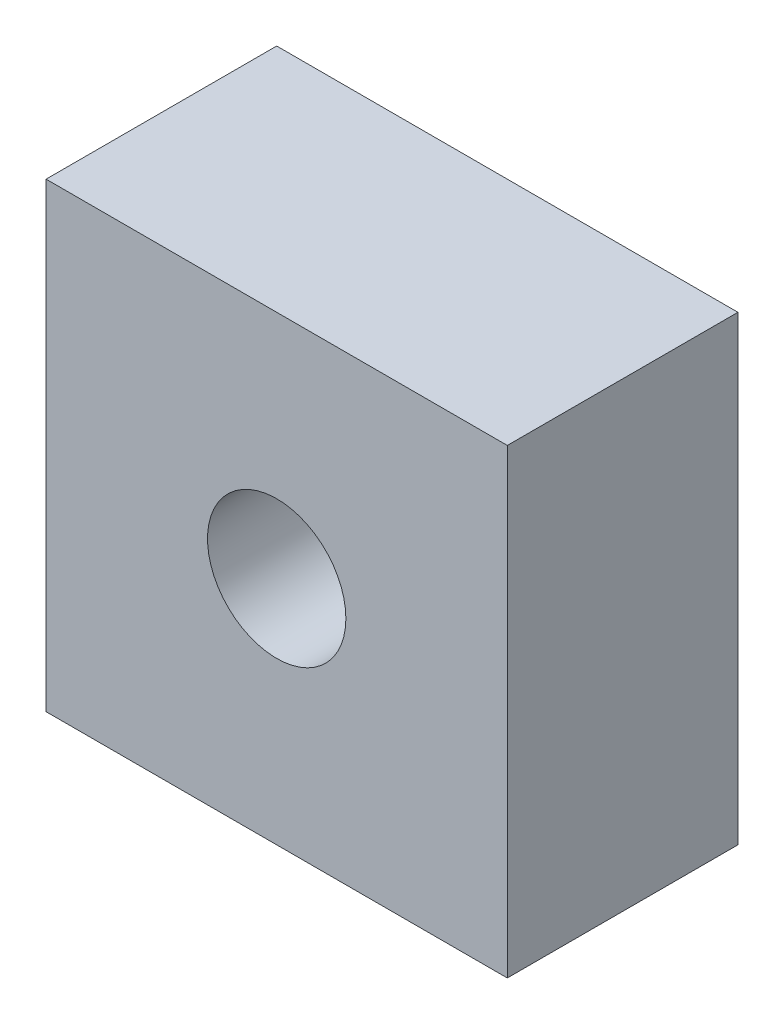
ISO-10303-21;
HEADER;
FILE_DESCRIPTION(('STEP AP214'),'2;1');
FILE_NAME('part.step','',(''),(''),'','','');
FILE_SCHEMA(('AUTOMOTIVE_DESIGN { 1 0 10303 214 1 1 1 1 }'));
ENDSEC;
DATA;
#1=APPLICATION_CONTEXT('core data for automotive mechanical design processes');
#2=APPLICATION_PROTOCOL_DEFINITION('international standard','automotive_design',2000,#1);
#3=PRODUCT_CONTEXT('',#1,'mechanical');
#4=PRODUCT('Part','Part','',(#3));
#5=PRODUCT_RELATED_PRODUCT_CATEGORY('part','',(#4));
#6=PRODUCT_DEFINITION_FORMATION('','',#4);
#7=PRODUCT_DEFINITION_CONTEXT('part definition',#1,'design');
#8=PRODUCT_DEFINITION('design','',#6,#7);
#9=PRODUCT_DEFINITION_SHAPE('','',#8);
#10=(LENGTH_UNIT() NAMED_UNIT(*) SI_UNIT(.MILLI.,.METRE.));
#11=(NAMED_UNIT(*) PLANE_ANGLE_UNIT() SI_UNIT($,.RADIAN.));
#12=(NAMED_UNIT(*) SI_UNIT($,.STERADIAN.) SOLID_ANGLE_UNIT());
#13=UNCERTAINTY_MEASURE_WITH_UNIT(LENGTH_MEASURE(1.E-05),#10,'distance_accuracy_value','');
#14=(GEOMETRIC_REPRESENTATION_CONTEXT(3) GLOBAL_UNCERTAINTY_ASSIGNED_CONTEXT((#13)) GLOBAL_UNIT_ASSIGNED_CONTEXT((#10,
#11,#12)) REPRESENTATION_CONTEXT('',''));
#15=CARTESIAN_POINT('',(0.,0.,0.));
#16=DIRECTION('',(0.,0.,1.));
#17=DIRECTION('',(1.,0.,0.));
#18=AXIS2_PLACEMENT_3D('',#15,#16,#17);
#19=CARTESIAN_POINT('',(0.,0.,10.));
#20=DIRECTION('',(1.,0.,0.));
#21=DIRECTION('',(0.,0.,-1.));
#22=AXIS2_PLACEMENT_3D('',#19,#20,#21);
#23=PLANE('',#22);
#24=DIRECTION('',(0.,-1.,0.));
#25=VECTOR('',#24,1.);
#26=CARTESIAN_POINT('',(0.,0.,0.));
#27=LINE('',#26,#25);
#28=CARTESIAN_POINT('',(0.,20.,0.));
#29=VERTEX_POINT('',#28);
#30=CARTESIAN_POINT('',(0.,0.,0.));
#31=VERTEX_POINT('',#30);
#32=EDGE_CURVE('E104',#29,#31,#27,.T.);
#33=ORIENTED_EDGE('',*,*,#32,.T.);
#34=DIRECTION('',(0.,0.,-1.));
#35=VECTOR('',#34,1.);
#36=CARTESIAN_POINT('',(0.,0.,10.));
#37=LINE('',#36,#35);
#38=CARTESIAN_POINT('',(0.,0.,10.));
#39=VERTEX_POINT('',#38);
#40=EDGE_CURVE('E11',#39,#31,#37,.T.);
#41=ORIENTED_EDGE('',*,*,#40,.F.);
#42=DIRECTION('',(0.,-1.,0.));
#43=VECTOR('',#42,1.);
#44=CARTESIAN_POINT('',(0.,0.,10.));
#45=LINE('',#44,#43);
#46=CARTESIAN_POINT('',(0.,20.,10.));
#47=VERTEX_POINT('',#46);
#48=EDGE_CURVE('E91',#47,#39,#45,.T.);
#49=ORIENTED_EDGE('',*,*,#48,.F.);
#50=DIRECTION('',(0.,0.,-1.));
#51=VECTOR('',#50,1.);
#52=CARTESIAN_POINT('',(0.,20.,10.));
#53=LINE('',#52,#51);
#54=EDGE_CURVE('E101',#47,#29,#53,.T.);
#55=ORIENTED_EDGE('',*,*,#54,.T.);
#56=EDGE_LOOP('',(#33,#41,#49,#55));
#57=FACE_BOUND('',#56,.T.);
#58=ADVANCED_FACE('F45',(#57),#23,.F.);
#59=CARTESIAN_POINT('',(0.,0.,10.));
#60=DIRECTION('',(0.,1.,0.));
#61=DIRECTION('',(0.,0.,1.));
#62=AXIS2_PLACEMENT_3D('',#59,#60,#61);
#63=PLANE('',#62);
#64=DIRECTION('',(1.,0.,0.));
#65=VECTOR('',#64,1.);
#66=CARTESIAN_POINT('',(0.,0.,0.));
#67=LINE('',#66,#65);
#68=CARTESIAN_POINT('',(20.,0.,0.));
#69=VERTEX_POINT('',#68);
#70=EDGE_CURVE('E100',#31,#69,#67,.T.);
#71=ORIENTED_EDGE('',*,*,#70,.T.);
#72=DIRECTION('',(0.,0.,-1.));
#73=VECTOR('',#72,1.);
#74=CARTESIAN_POINT('',(20.,0.,10.));
#75=LINE('',#74,#73);
#76=CARTESIAN_POINT('',(20.,0.,10.));
#77=VERTEX_POINT('',#76);
#78=EDGE_CURVE('E49',#77,#69,#75,.T.);
#79=ORIENTED_EDGE('',*,*,#78,.F.);
#80=DIRECTION('',(1.,0.,0.));
#81=VECTOR('',#80,1.);
#82=CARTESIAN_POINT('',(0.,0.,10.));
#83=LINE('',#82,#81);
#84=EDGE_CURVE('E86',#39,#77,#83,.T.);
#85=ORIENTED_EDGE('',*,*,#84,.F.);
#86=ORIENTED_EDGE('',*,*,#40,.T.);
#87=EDGE_LOOP('',(#71,#79,#85,#86));
#88=FACE_BOUND('',#87,.T.);
#89=ADVANCED_FACE('F96',(#88),#63,.F.);
#90=CARTESIAN_POINT('',(20.,0.,10.));
#91=DIRECTION('',(-1.,0.,0.));
#92=DIRECTION('',(0.,0.,1.));
#93=AXIS2_PLACEMENT_3D('',#90,#91,#92);
#94=PLANE('',#93);
#95=DIRECTION('',(0.,1.,0.));
#96=VECTOR('',#95,1.);
#97=CARTESIAN_POINT('',(20.,0.,0.));
#98=LINE('',#97,#96);
#99=CARTESIAN_POINT('',(20.,20.,0.));
#100=VERTEX_POINT('',#99);
#101=EDGE_CURVE('E73',#69,#100,#98,.T.);
#102=ORIENTED_EDGE('',*,*,#101,.T.);
#103=DIRECTION('',(0.,0.,-1.));
#104=VECTOR('',#103,1.);
#105=CARTESIAN_POINT('',(20.,20.,10.));
#106=LINE('',#105,#104);
#107=CARTESIAN_POINT('',(20.,20.,10.));
#108=VERTEX_POINT('',#107);
#109=EDGE_CURVE('E98',#108,#100,#106,.T.);
#110=ORIENTED_EDGE('',*,*,#109,.F.);
#111=DIRECTION('',(0.,1.,0.));
#112=VECTOR('',#111,1.);
#113=CARTESIAN_POINT('',(20.,0.,10.));
#114=LINE('',#113,#112);
#115=EDGE_CURVE('E93',#77,#108,#114,.T.);
#116=ORIENTED_EDGE('',*,*,#115,.F.);
#117=ORIENTED_EDGE('',*,*,#78,.T.);
#118=EDGE_LOOP('',(#102,#110,#116,#117));
#119=FACE_BOUND('',#118,.T.);
#120=ADVANCED_FACE('F97',(#119),#94,.F.);
#121=CARTESIAN_POINT('',(0.,20.,10.));
#122=DIRECTION('',(0.,-1.,0.));
#123=DIRECTION('',(0.,0.,-1.));
#124=AXIS2_PLACEMENT_3D('',#121,#122,#123);
#125=PLANE('',#124);
#126=DIRECTION('',(-1.,0.,0.));
#127=VECTOR('',#126,1.);
#128=CARTESIAN_POINT('',(0.,20.,0.));
#129=LINE('',#128,#127);
#130=EDGE_CURVE('E81',#100,#29,#129,.T.);
#131=ORIENTED_EDGE('',*,*,#130,.T.);
#132=ORIENTED_EDGE('',*,*,#54,.F.);
#133=DIRECTION('',(-1.,0.,0.));
#134=VECTOR('',#133,1.);
#135=CARTESIAN_POINT('',(0.,20.,10.));
#136=LINE('',#135,#134);
#137=EDGE_CURVE('E59',#108,#47,#136,.T.);
#138=ORIENTED_EDGE('',*,*,#137,.F.);
#139=ORIENTED_EDGE('',*,*,#109,.T.);
#140=EDGE_LOOP('',(#131,#132,#138,#139));
#141=FACE_BOUND('',#140,.T.);
#142=ADVANCED_FACE('F114',(#141),#125,.F.);
#143=CARTESIAN_POINT('',(0.,0.,10.));
#144=DIRECTION('',(0.,0.,-1.));
#145=DIRECTION('',(-1.,0.,0.));
#146=AXIS2_PLACEMENT_3D('',#143,#144,#145);
#147=PLANE('',#146);
#148=CARTESIAN_POINT('',(10.,10.,10.));
#149=DIRECTION('',(0.,0.,1.));
#150=DIRECTION('',(1.,0.,0.));
#151=AXIS2_PLACEMENT_3D('',#148,#149,#150);
#152=CIRCLE('',#151,3.);
#153=CARTESIAN_POINT('',(13.,10.,10.));
#154=VERTEX_POINT('',#153);
#155=EDGE_CURVE('E122',#154,#154,#152,.T.);
#156=ORIENTED_EDGE('',*,*,#155,.F.);
#157=EDGE_LOOP('',(#156));
#158=FACE_BOUND('',#157,.T.);
#159=ORIENTED_EDGE('',*,*,#48,.T.);
#160=ORIENTED_EDGE('',*,*,#84,.T.);
#161=ORIENTED_EDGE('',*,*,#115,.T.);
#162=ORIENTED_EDGE('',*,*,#137,.T.);
#163=EDGE_LOOP('',(#159,#160,#161,#162));
#164=FACE_BOUND('',#163,.T.);
#165=ADVANCED_FACE('F90',(#158,#164),#147,.F.);
#166=CARTESIAN_POINT('',(0.,0.,0.));
#167=DIRECTION('',(0.,0.,-1.));
#168=DIRECTION('',(-1.,0.,0.));
#169=AXIS2_PLACEMENT_3D('',#166,#167,#168);
#170=PLANE('',#169);
#171=CARTESIAN_POINT('',(10.,10.,0.));
#172=DIRECTION('',(0.,0.,-1.));
#173=DIRECTION('',(-1.,0.,0.));
#174=AXIS2_PLACEMENT_3D('',#171,#172,#173);
#175=CIRCLE('',#174,3.);
#176=CARTESIAN_POINT('',(7.,10.,0.));
#177=VERTEX_POINT('',#176);
#178=EDGE_CURVE('E107',#177,#177,#175,.F.);
#179=ORIENTED_EDGE('',*,*,#178,.T.);
#180=EDGE_LOOP('',(#179));
#181=FACE_BOUND('',#180,.T.);
#182=ORIENTED_EDGE('',*,*,#32,.F.);
#183=ORIENTED_EDGE('',*,*,#130,.F.);
#184=ORIENTED_EDGE('',*,*,#101,.F.);
#185=ORIENTED_EDGE('',*,*,#70,.F.);
#186=EDGE_LOOP('',(#182,#183,#184,#185));
#187=FACE_BOUND('',#186,.T.);
#188=ADVANCED_FACE('F116',(#181,#187),#170,.T.);
#189=CARTESIAN_POINT('',(10.,10.,-8.48528137423857));
#190=DIRECTION('',(0.,0.,1.));
#191=DIRECTION('',(1.,0.,0.));
#192=AXIS2_PLACEMENT_3D('',#189,#190,#191);
#193=CYLINDRICAL_SURFACE('',#192,3.);
#194=ORIENTED_EDGE('',*,*,#155,.T.);
#195=EDGE_LOOP('',(#194));
#196=FACE_BOUND('',#195,.T.);
#197=ORIENTED_EDGE('',*,*,#178,.F.);
#198=EDGE_LOOP('',(#197));
#199=FACE_BOUND('',#198,.T.);
#200=ADVANCED_FACE('F123',(#196,#199),#193,.F.);
#201=CLOSED_SHELL('',(#58,#89,#120,#142,#165,#188,#200));
#202=MANIFOLD_SOLID_BREP('B2',#201);
#203=ADVANCED_BREP_SHAPE_REPRESENTATION('',(#18,#202),#14);
#204=SHAPE_DEFINITION_REPRESENTATION(#9,#203);
ENDSEC;
END-ISO-10303-21;
